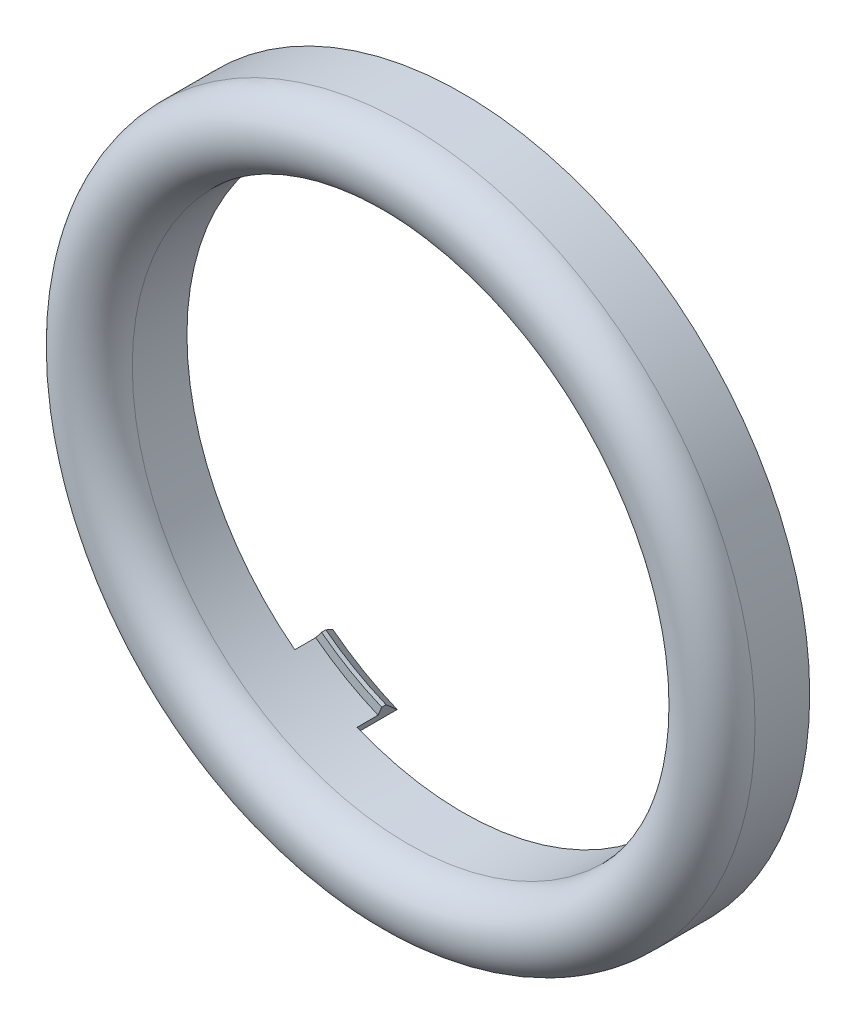
ISO-10303-21;
HEADER;
FILE_DESCRIPTION(('STEP AP214'),'2;1');
FILE_NAME('part.step','',(''),(''),'','','');
FILE_SCHEMA(('AUTOMOTIVE_DESIGN { 1 0 10303 214 1 1 1 1 }'));
ENDSEC;
DATA;
#1=APPLICATION_CONTEXT('core data for automotive mechanical design processes');
#2=APPLICATION_PROTOCOL_DEFINITION('international standard','automotive_design',2000,#1);
#3=PRODUCT_CONTEXT('',#1,'mechanical');
#4=PRODUCT('Part','Part','',(#3));
#5=PRODUCT_RELATED_PRODUCT_CATEGORY('part','',(#4));
#6=PRODUCT_DEFINITION_FORMATION('','',#4);
#7=PRODUCT_DEFINITION_CONTEXT('part definition',#1,'design');
#8=PRODUCT_DEFINITION('design','',#6,#7);
#9=PRODUCT_DEFINITION_SHAPE('','',#8);
#10=(LENGTH_UNIT() NAMED_UNIT(*) SI_UNIT(.MILLI.,.METRE.));
#11=(NAMED_UNIT(*) PLANE_ANGLE_UNIT() SI_UNIT($,.RADIAN.));
#12=(NAMED_UNIT(*) SI_UNIT($,.STERADIAN.) SOLID_ANGLE_UNIT());
#13=UNCERTAINTY_MEASURE_WITH_UNIT(LENGTH_MEASURE(1.E-05),#10,'distance_accuracy_value','');
#14=(GEOMETRIC_REPRESENTATION_CONTEXT(3) GLOBAL_UNCERTAINTY_ASSIGNED_CONTEXT((#13)) GLOBAL_UNIT_ASSIGNED_CONTEXT((#10,
#11,#12)) REPRESENTATION_CONTEXT('',''));
#15=CARTESIAN_POINT('',(0.,0.,0.));
#16=DIRECTION('',(0.,0.,1.));
#17=DIRECTION('',(1.,0.,0.));
#18=AXIS2_PLACEMENT_3D('',#15,#16,#17);
#19=CARTESIAN_POINT('',(-36.5,0.,0.));
#20=DIRECTION('',(0.,0.,-1.));
#21=DIRECTION('',(-1.,0.,0.));
#22=AXIS2_PLACEMENT_3D('',#19,#20,#21);
#23=PLANE('',#22);
#24=CARTESIAN_POINT('',(0.,0.,0.));
#25=DIRECTION('',(0.,0.,-1.));
#26=DIRECTION('',(-1.,0.,0.));
#27=AXIS2_PLACEMENT_3D('',#24,#25,#26);
#28=CIRCLE('',#27,36.5);
#29=CARTESIAN_POINT('',(-36.5,0.,0.));
#30=VERTEX_POINT('',#29);
#31=EDGE_CURVE('E11',#30,#30,#28,.T.);
#32=ORIENTED_EDGE('',*,*,#31,.T.);
#33=EDGE_LOOP('',(#32));
#34=FACE_BOUND('',#33,.T.);
#35=CARTESIAN_POINT('',(0.,0.,0.));
#36=DIRECTION('',(0.,0.,-1.));
#37=DIRECTION('',(-1.,0.,0.));
#38=AXIS2_PLACEMENT_3D('',#35,#36,#37);
#39=CIRCLE('',#38,29.);
#40=CARTESIAN_POINT('',(28.7519009798405,-3.7852595743815,0.));
#41=VERTEX_POINT('',#40);
#42=CARTESIAN_POINT('',(-11.0978195385873,-26.7925064428274,0.));
#43=VERTEX_POINT('',#42);
#44=EDGE_CURVE('E377',#41,#43,#39,.T.);
#45=ORIENTED_EDGE('',*,*,#44,.F.);
#46=DIRECTION('',(0.99144486137381,-0.130526192220052,0.));
#47=VECTOR('',#46,1.);
#48=CARTESIAN_POINT('',(29.6442013550769,-3.90273314737955,0.));
#49=LINE('',#48,#47);
#50=CARTESIAN_POINT('',(29.6442013550769,-3.90273314737955,0.));
#51=VERTEX_POINT('',#50);
#52=EDGE_CURVE('E206',#41,#51,#49,.T.);
#53=ORIENTED_EDGE('',*,*,#52,.T.);
#54=CARTESIAN_POINT('',(0.,0.,0.));
#55=DIRECTION('',(0.,0.,-1.));
#56=DIRECTION('',(-1.,0.,0.));
#57=AXIS2_PLACEMENT_3D('',#54,#55,#56);
#58=CIRCLE('',#57,29.9);
#59=CARTESIAN_POINT('',(29.6442013550769,3.90273314737955,0.));
#60=VERTEX_POINT('',#59);
#61=EDGE_CURVE('E196',#60,#51,#58,.T.);
#62=ORIENTED_EDGE('',*,*,#61,.F.);
#63=DIRECTION('',(0.99144486137381,0.130526192220052,0.));
#64=VECTOR('',#63,1.);
#65=CARTESIAN_POINT('',(29.6442013550769,3.90273314737955,0.));
#66=LINE('',#65,#64);
#67=CARTESIAN_POINT('',(28.7519009798405,3.78525957438151,0.));
#68=VERTEX_POINT('',#67);
#69=EDGE_CURVE('E234',#68,#60,#66,.T.);
#70=ORIENTED_EDGE('',*,*,#69,.F.);
#71=CARTESIAN_POINT('',(-11.0978195385877,26.7925064428273,0.));
#72=VERTEX_POINT('',#71);
#73=EDGE_CURVE('E382',#72,#68,#39,.T.);
#74=ORIENTED_EDGE('',*,*,#73,.F.);
#75=DIRECTION('',(-0.382683432365094,0.923879532511285,0.));
#76=VECTOR('',#75,1.);
#77=CARTESIAN_POINT('',(-11.4422346277163,27.6239980220874,0.));
#78=LINE('',#77,#76);
#79=CARTESIAN_POINT('',(-11.4422346277163,27.6239980220874,0.));
#80=VERTEX_POINT('',#79);
#81=EDGE_CURVE('E263',#72,#80,#78,.T.);
#82=ORIENTED_EDGE('',*,*,#81,.T.);
#83=CARTESIAN_POINT('',(0.,0.,0.));
#84=DIRECTION('',(0.,0.,-1.));
#85=DIRECTION('',(0.500000000000004,-0.866025403784436,0.));
#86=AXIS2_PLACEMENT_3D('',#83,#84,#85);
#87=CIRCLE('',#86,29.9);
#88=CARTESIAN_POINT('',(-18.2019667273609,23.7212648747078,0.));
#89=VERTEX_POINT('',#88);
#90=EDGE_CURVE('E302',#89,#80,#87,.T.);
#91=ORIENTED_EDGE('',*,*,#90,.F.);
#92=DIRECTION('',(-0.608761429008725,0.793353340291232,0.));
#93=VECTOR('',#92,1.);
#94=CARTESIAN_POINT('',(-18.2019667273609,23.7212648747078,0.));
#95=LINE('',#94,#93);
#96=CARTESIAN_POINT('',(-17.654081441253,23.0072468684457,0.));
#97=VERTEX_POINT('',#96);
#98=EDGE_CURVE('E286',#97,#89,#95,.T.);
#99=ORIENTED_EDGE('',*,*,#98,.F.);
#100=CARTESIAN_POINT('',(-17.6540814412527,-23.007246868446,0.));
#101=VERTEX_POINT('',#100);
#102=EDGE_CURVE('E378',#101,#97,#39,.T.);
#103=ORIENTED_EDGE('',*,*,#102,.F.);
#104=DIRECTION('',(-0.608761429008713,-0.793353340291241,0.));
#105=VECTOR('',#104,1.);
#106=CARTESIAN_POINT('',(-18.2019667273605,-23.7212648747081,0.));
#107=LINE('',#106,#105);
#108=CARTESIAN_POINT('',(-18.2019667273605,-23.7212648747081,0.));
#109=VERTEX_POINT('',#108);
#110=EDGE_CURVE('E322',#101,#109,#107,.T.);
#111=ORIENTED_EDGE('',*,*,#110,.T.);
#112=CARTESIAN_POINT('',(0.,0.,0.));
#113=DIRECTION('',(0.,0.,-1.));
#114=DIRECTION('',(0.499999999999992,0.866025403784443,0.));
#115=AXIS2_PLACEMENT_3D('',#112,#113,#114);
#116=CIRCLE('',#115,29.9);
#117=CARTESIAN_POINT('',(-11.4422346277159,-27.6239980220876,0.));
#118=VERTEX_POINT('',#117);
#119=EDGE_CURVE('E364',#118,#109,#116,.T.);
#120=ORIENTED_EDGE('',*,*,#119,.F.);
#121=DIRECTION('',(-0.382683432365081,-0.92387953251129,0.));
#122=VECTOR('',#121,1.);
#123=CARTESIAN_POINT('',(-11.4422346277159,-27.6239980220876,0.));
#124=LINE('',#123,#122);
#125=EDGE_CURVE('E345',#43,#118,#124,.T.);
#126=ORIENTED_EDGE('',*,*,#125,.F.);
#127=EDGE_LOOP('',(#45,#53,#62,#70,#74,#82,#91,#99,#103,#111,#120,#126));
#128=FACE_BOUND('',#127,.T.);
#129=ADVANCED_FACE('F49',(#34,#128),#23,.T.);
#130=CARTESIAN_POINT('',(0.,0.,0.));
#131=DIRECTION('',(0.,0.,-1.));
#132=DIRECTION('',(-1.,0.,0.));
#133=AXIS2_PLACEMENT_3D('',#130,#131,#132);
#134=CYLINDRICAL_SURFACE('',#133,36.5);
#135=CARTESIAN_POINT('',(0.,0.,5.75));
#136=DIRECTION('',(0.,0.,-1.));
#137=DIRECTION('',(-1.,0.,0.));
#138=AXIS2_PLACEMENT_3D('',#135,#136,#137);
#139=CIRCLE('',#138,36.5);
#140=CARTESIAN_POINT('',(-36.5,0.,5.75));
#141=VERTEX_POINT('',#140);
#142=EDGE_CURVE('E57',#141,#141,#139,.T.);
#143=ORIENTED_EDGE('',*,*,#142,.T.);
#144=EDGE_LOOP('',(#143));
#145=FACE_BOUND('',#144,.T.);
#146=ORIENTED_EDGE('',*,*,#31,.F.);
#147=EDGE_LOOP('',(#146));
#148=FACE_BOUND('',#147,.T.);
#149=ADVANCED_FACE('F389',(#145,#148),#134,.T.);
#150=CARTESIAN_POINT('',(0.,0.,5.75));
#151=DIRECTION('',(0.,0.,-1.));
#152=DIRECTION('',(-1.,0.,0.));
#153=AXIS2_PLACEMENT_3D('',#150,#151,#152);
#154=TOROIDAL_SURFACE('',#153,32.75,3.75);
#155=CARTESIAN_POINT('',(0.,0.,5.75));
#156=DIRECTION('',(0.,0.,-1.));
#157=DIRECTION('',(-1.,0.,0.));
#158=AXIS2_PLACEMENT_3D('',#155,#156,#157);
#159=CIRCLE('',#158,29.);
#160=CARTESIAN_POINT('',(-29.,0.,5.75));
#161=VERTEX_POINT('',#160);
#162=EDGE_CURVE('E381',#161,#161,#159,.T.);
#163=ORIENTED_EDGE('',*,*,#162,.T.);
#164=EDGE_LOOP('',(#163));
#165=FACE_BOUND('',#164,.T.);
#166=ORIENTED_EDGE('',*,*,#142,.F.);
#167=EDGE_LOOP('',(#166));
#168=FACE_BOUND('',#167,.T.);
#169=ADVANCED_FACE('F392',(#165,#168),#154,.T.);
#170=CARTESIAN_POINT('',(0.,0.,0.));
#171=DIRECTION('',(0.,0.,-1.));
#172=DIRECTION('',(-1.,0.,0.));
#173=AXIS2_PLACEMENT_3D('',#170,#171,#172);
#174=CYLINDRICAL_SURFACE('',#173,29.);
#175=ORIENTED_EDGE('',*,*,#102,.T.);
#176=DIRECTION('',(0.,0.,1.));
#177=VECTOR('',#176,1.);
#178=CARTESIAN_POINT('',(-17.654081441253,23.0072468684457,-2.2));
#179=LINE('',#178,#177);
#180=CARTESIAN_POINT('',(-17.654081441253,23.0072468684457,-2.2));
#181=VERTEX_POINT('',#180);
#182=EDGE_CURVE('E283',#181,#97,#179,.T.);
#183=ORIENTED_EDGE('',*,*,#182,.F.);
#184=CARTESIAN_POINT('',(0.,0.,-2.2));
#185=DIRECTION('',(0.,0.,-1.));
#186=DIRECTION('',(0.500000000000004,-0.866025403784436,0.));
#187=AXIS2_PLACEMENT_3D('',#184,#185,#186);
#188=CIRCLE('',#187,29.);
#189=CARTESIAN_POINT('',(-11.0978195385877,26.7925064428273,-2.2));
#190=VERTEX_POINT('',#189);
#191=EDGE_CURVE('E299',#181,#190,#188,.T.);
#192=ORIENTED_EDGE('',*,*,#191,.T.);
#193=DIRECTION('',(0.,0.,1.));
#194=VECTOR('',#193,1.);
#195=CARTESIAN_POINT('',(-11.0978195385877,26.7925064428273,-2.2));
#196=LINE('',#195,#194);
#197=EDGE_CURVE('E260',#190,#72,#196,.T.);
#198=ORIENTED_EDGE('',*,*,#197,.T.);
#199=ORIENTED_EDGE('',*,*,#73,.T.);
#200=DIRECTION('',(0.,0.,1.));
#201=VECTOR('',#200,1.);
#202=CARTESIAN_POINT('',(28.7519009798405,3.78525957438151,-2.2));
#203=LINE('',#202,#201);
#204=CARTESIAN_POINT('',(28.7519009798405,3.78525957438151,-2.2));
#205=VERTEX_POINT('',#204);
#206=EDGE_CURVE('E190',#205,#68,#203,.T.);
#207=ORIENTED_EDGE('',*,*,#206,.F.);
#208=CARTESIAN_POINT('',(0.,0.,-2.2));
#209=DIRECTION('',(0.,0.,-1.));
#210=DIRECTION('',(-1.,0.,0.));
#211=AXIS2_PLACEMENT_3D('',#208,#209,#210);
#212=CIRCLE('',#211,29.);
#213=CARTESIAN_POINT('',(28.7519009798405,-3.7852595743815,-2.2));
#214=VERTEX_POINT('',#213);
#215=EDGE_CURVE('E182',#205,#214,#212,.T.);
#216=ORIENTED_EDGE('',*,*,#215,.T.);
#217=DIRECTION('',(0.,0.,1.));
#218=VECTOR('',#217,1.);
#219=CARTESIAN_POINT('',(28.7519009798405,-3.7852595743815,-2.2));
#220=LINE('',#219,#218);
#221=EDGE_CURVE('E187',#214,#41,#220,.T.);
#222=ORIENTED_EDGE('',*,*,#221,.T.);
#223=ORIENTED_EDGE('',*,*,#44,.T.);
#224=DIRECTION('',(0.,0.,1.));
#225=VECTOR('',#224,1.);
#226=CARTESIAN_POINT('',(-11.0978195385873,-26.7925064428274,-2.2));
#227=LINE('',#226,#225);
#228=CARTESIAN_POINT('',(-11.0978195385873,-26.7925064428274,-2.2));
#229=VERTEX_POINT('',#228);
#230=EDGE_CURVE('E341',#229,#43,#227,.T.);
#231=ORIENTED_EDGE('',*,*,#230,.F.);
#232=CARTESIAN_POINT('',(0.,0.,-2.2));
#233=DIRECTION('',(0.,0.,-1.));
#234=DIRECTION('',(0.499999999999992,0.866025403784443,0.));
#235=AXIS2_PLACEMENT_3D('',#232,#233,#234);
#236=CIRCLE('',#235,29.);
#237=CARTESIAN_POINT('',(-17.6540814412527,-23.007246868446,-2.2));
#238=VERTEX_POINT('',#237);
#239=EDGE_CURVE('E361',#229,#238,#236,.T.);
#240=ORIENTED_EDGE('',*,*,#239,.T.);
#241=DIRECTION('',(0.,0.,1.));
#242=VECTOR('',#241,1.);
#243=CARTESIAN_POINT('',(-17.6540814412527,-23.007246868446,-2.2));
#244=LINE('',#243,#242);
#245=EDGE_CURVE('E318',#238,#101,#244,.T.);
#246=ORIENTED_EDGE('',*,*,#245,.T.);
#247=EDGE_LOOP('',(#175,#183,#192,#198,#199,#207,#216,#222,#223,#231,#240,#246));
#248=FACE_BOUND('',#247,.T.);
#249=ORIENTED_EDGE('',*,*,#162,.F.);
#250=EDGE_LOOP('',(#249));
#251=FACE_BOUND('',#250,.T.);
#252=ADVANCED_FACE('F185',(#248,#251),#174,.F.);
#253=CARTESIAN_POINT('',(-11.0978195385873,-26.7925064428274,-2.2));
#254=DIRECTION('',(0.,0.,-1.));
#255=DIRECTION('',(0.499999999999992,0.866025403784443,0.));
#256=AXIS2_PLACEMENT_3D('',#253,#254,#255);
#257=PLANE('',#256);
#258=CARTESIAN_POINT('',(0.,0.,-2.20000000000001));
#259=DIRECTION('',(0.,0.,-1.));
#260=DIRECTION('',(0.499999999999992,0.866025403784443,0.));
#261=AXIS2_PLACEMENT_3D('',#258,#259,#260);
#262=CIRCLE('',#261,28.);
#263=CARTESIAN_POINT('',(-10.7151361062223,-25.8686269103161,-2.20000000000001));
#264=VERTEX_POINT('',#263);
#265=CARTESIAN_POINT('',(-17.045320012244,-22.2138935281547,-2.20000000000001));
#266=VERTEX_POINT('',#265);
#267=EDGE_CURVE('E374',#264,#266,#262,.T.);
#268=ORIENTED_EDGE('',*,*,#267,.T.);
#269=DIRECTION('',(-0.608761429008713,-0.793353340291241,0.));
#270=VECTOR('',#269,1.);
#271=CARTESIAN_POINT('',(-17.6540814412527,-23.007246868446,-2.2));
#272=LINE('',#271,#270);
#273=EDGE_CURVE('E314',#266,#238,#272,.T.);
#274=ORIENTED_EDGE('',*,*,#273,.T.);
#275=ORIENTED_EDGE('',*,*,#239,.F.);
#276=DIRECTION('',(-0.382683432365081,-0.92387953251129,0.));
#277=VECTOR('',#276,1.);
#278=CARTESIAN_POINT('',(-11.0978195385873,-26.7925064428274,-2.2));
#279=LINE('',#278,#277);
#280=EDGE_CURVE('E337',#264,#229,#279,.T.);
#281=ORIENTED_EDGE('',*,*,#280,.F.);
#282=EDGE_LOOP('',(#268,#274,#275,#281));
#283=FACE_BOUND('',#282,.T.);
#284=ADVANCED_FACE('F400',(#283),#257,.F.);
#285=CARTESIAN_POINT('',(0.,0.,0.));
#286=DIRECTION('',(0.,0.,-1.));
#287=DIRECTION('',(0.499999999999992,0.866025403784443,0.));
#288=AXIS2_PLACEMENT_3D('',#285,#286,#287);
#289=CYLINDRICAL_SURFACE('',#288,28.);
#290=CARTESIAN_POINT('',(0.,0.,-2.64999999999997));
#291=DIRECTION('',(0.,0.,-1.));
#292=DIRECTION('',(0.499999999999992,0.866025403784443,0.));
#293=AXIS2_PLACEMENT_3D('',#290,#291,#292);
#294=CIRCLE('',#293,28.);
#295=CARTESIAN_POINT('',(-10.7151361062223,-25.8686269103161,-2.64999999999997));
#296=VERTEX_POINT('',#295);
#297=CARTESIAN_POINT('',(-17.045320012244,-22.2138935281547,-2.64999999999997));
#298=VERTEX_POINT('',#297);
#299=EDGE_CURVE('E371',#296,#298,#294,.T.);
#300=ORIENTED_EDGE('',*,*,#299,.T.);
#301=DIRECTION('',(0.,0.,1.));
#302=VECTOR('',#301,1.);
#303=CARTESIAN_POINT('',(-17.045320012244,-22.2138935281547,-2.20000000000001));
#304=LINE('',#303,#302);
#305=EDGE_CURVE('E333',#298,#266,#304,.T.);
#306=ORIENTED_EDGE('',*,*,#305,.T.);
#307=ORIENTED_EDGE('',*,*,#267,.F.);
#308=DIRECTION('',(0.,0.,1.));
#309=VECTOR('',#308,1.);
#310=CARTESIAN_POINT('',(-10.7151361062223,-25.8686269103161,-2.20000000000001));
#311=LINE('',#310,#309);
#312=EDGE_CURVE('E357',#296,#264,#311,.T.);
#313=ORIENTED_EDGE('',*,*,#312,.F.);
#314=EDGE_LOOP('',(#300,#306,#307,#313));
#315=FACE_BOUND('',#314,.T.);
#316=ADVANCED_FACE('F474',(#315),#289,.F.);
#317=CARTESIAN_POINT('',(0.,0.,-4.55));
#318=DIRECTION('',(0.,0.,-1.));
#319=DIRECTION('',(0.499999999999992,0.866025403784443,0.));
#320=AXIS2_PLACEMENT_3D('',#317,#318,#319);
#321=CONICAL_SURFACE('',#320,29.9,0.785398163397443);
#322=CARTESIAN_POINT('',(0.,0.,-4.55));
#323=DIRECTION('',(0.,0.,-1.));
#324=DIRECTION('',(0.499999999999992,0.866025403784443,0.));
#325=AXIS2_PLACEMENT_3D('',#322,#323,#324);
#326=CIRCLE('',#325,29.9);
#327=CARTESIAN_POINT('',(-11.4422346277159,-27.6239980220876,-4.55));
#328=VERTEX_POINT('',#327);
#329=CARTESIAN_POINT('',(-18.2019667273605,-23.7212648747081,-4.55));
#330=VERTEX_POINT('',#329);
#331=EDGE_CURVE('E368',#328,#330,#326,.T.);
#332=ORIENTED_EDGE('',*,*,#331,.T.);
#333=DIRECTION('',(0.430459334576871,0.560985526796931,0.707106781186553));
#334=VECTOR('',#333,1.);
#335=CARTESIAN_POINT('',(-17.045320012244,-22.2138935281547,-2.64999999999997));
#336=LINE('',#335,#334);
#337=EDGE_CURVE('E329',#330,#298,#336,.T.);
#338=ORIENTED_EDGE('',*,*,#337,.T.);
#339=ORIENTED_EDGE('',*,*,#299,.F.);
#340=DIRECTION('',(0.27059805007309,0.653281482438186,0.707106781186553));
#341=VECTOR('',#340,1.);
#342=CARTESIAN_POINT('',(-10.7151361062223,-25.8686269103161,-2.64999999999997));
#343=LINE('',#342,#341);
#344=EDGE_CURVE('E353',#328,#296,#343,.T.);
#345=ORIENTED_EDGE('',*,*,#344,.F.);
#346=EDGE_LOOP('',(#332,#338,#339,#345));
#347=FACE_BOUND('',#346,.T.);
#348=ADVANCED_FACE('F478',(#347),#321,.F.);
#349=CARTESIAN_POINT('',(0.,0.,0.));
#350=DIRECTION('',(0.,0.,-1.));
#351=DIRECTION('',(0.499999999999992,0.866025403784443,0.));
#352=AXIS2_PLACEMENT_3D('',#349,#350,#351);
#353=CYLINDRICAL_SURFACE('',#352,29.9);
#354=ORIENTED_EDGE('',*,*,#119,.T.);
#355=DIRECTION('',(0.,0.,-1.));
#356=VECTOR('',#355,1.);
#357=CARTESIAN_POINT('',(-18.2019667273605,-23.7212648747081,-4.55));
#358=LINE('',#357,#356);
#359=EDGE_CURVE('E325',#109,#330,#358,.T.);
#360=ORIENTED_EDGE('',*,*,#359,.T.);
#361=ORIENTED_EDGE('',*,*,#331,.F.);
#362=DIRECTION('',(0.,0.,-1.));
#363=VECTOR('',#362,1.);
#364=CARTESIAN_POINT('',(-11.4422346277159,-27.6239980220876,-4.55));
#365=LINE('',#364,#363);
#366=EDGE_CURVE('E349',#118,#328,#365,.T.);
#367=ORIENTED_EDGE('',*,*,#366,.F.);
#368=EDGE_LOOP('',(#354,#360,#361,#367));
#369=FACE_BOUND('',#368,.T.);
#370=ADVANCED_FACE('F470',(#369),#353,.T.);
#371=CARTESIAN_POINT('',(0.,0.,0.));
#372=DIRECTION('',(-0.92387953251129,0.382683432365081,0.));
#373=DIRECTION('',(0.,0.,-1.));
#374=AXIS2_PLACEMENT_3D('',#371,#372,#373);
#375=PLANE('',#374);
#376=ORIENTED_EDGE('',*,*,#280,.T.);
#377=ORIENTED_EDGE('',*,*,#230,.T.);
#378=ORIENTED_EDGE('',*,*,#125,.T.);
#379=ORIENTED_EDGE('',*,*,#366,.T.);
#380=ORIENTED_EDGE('',*,*,#344,.T.);
#381=ORIENTED_EDGE('',*,*,#312,.T.);
#382=EDGE_LOOP('',(#376,#377,#378,#379,#380,#381));
#383=FACE_BOUND('',#382,.T.);
#384=ADVANCED_FACE('F466',(#383),#375,.F.);
#385=CARTESIAN_POINT('',(0.,0.,0.));
#386=DIRECTION('',(-0.793353340291241,0.608761429008713,0.));
#387=DIRECTION('',(0.,0.,-1.));
#388=AXIS2_PLACEMENT_3D('',#385,#386,#387);
#389=PLANE('',#388);
#390=ORIENTED_EDGE('',*,*,#273,.F.);
#391=ORIENTED_EDGE('',*,*,#305,.F.);
#392=ORIENTED_EDGE('',*,*,#337,.F.);
#393=ORIENTED_EDGE('',*,*,#359,.F.);
#394=ORIENTED_EDGE('',*,*,#110,.F.);
#395=ORIENTED_EDGE('',*,*,#245,.F.);
#396=EDGE_LOOP('',(#390,#391,#392,#393,#394,#395));
#397=FACE_BOUND('',#396,.T.);
#398=ADVANCED_FACE('F453',(#397),#389,.T.);
#399=CARTESIAN_POINT('',(-17.654081441253,23.0072468684457,-2.2));
#400=DIRECTION('',(0.,0.,-1.));
#401=DIRECTION('',(0.500000000000004,-0.866025403784436,0.));
#402=AXIS2_PLACEMENT_3D('',#399,#400,#401);
#403=PLANE('',#402);
#404=CARTESIAN_POINT('',(0.,0.,-2.20000000000001));
#405=DIRECTION('',(0.,0.,-1.));
#406=DIRECTION('',(0.500000000000004,-0.866025403784436,0.));
#407=AXIS2_PLACEMENT_3D('',#404,#405,#406);
#408=CIRCLE('',#407,28.);
#409=CARTESIAN_POINT('',(-17.0453200122443,22.2138935281545,-2.20000000000001));
#410=VERTEX_POINT('',#409);
#411=CARTESIAN_POINT('',(-10.7151361062226,25.868626910316,-2.20000000000001));
#412=VERTEX_POINT('',#411);
#413=EDGE_CURVE('E311',#410,#412,#408,.T.);
#414=ORIENTED_EDGE('',*,*,#413,.T.);
#415=DIRECTION('',(-0.382683432365094,0.923879532511285,0.));
#416=VECTOR('',#415,1.);
#417=CARTESIAN_POINT('',(-11.0978195385877,26.7925064428273,-2.2));
#418=LINE('',#417,#416);
#419=EDGE_CURVE('E256',#412,#190,#418,.T.);
#420=ORIENTED_EDGE('',*,*,#419,.T.);
#421=ORIENTED_EDGE('',*,*,#191,.F.);
#422=DIRECTION('',(-0.608761429008725,0.793353340291232,0.));
#423=VECTOR('',#422,1.);
#424=CARTESIAN_POINT('',(-17.654081441253,23.0072468684457,-2.2));
#425=LINE('',#424,#423);
#426=EDGE_CURVE('E279',#410,#181,#425,.T.);
#427=ORIENTED_EDGE('',*,*,#426,.F.);
#428=EDGE_LOOP('',(#414,#420,#421,#427));
#429=FACE_BOUND('',#428,.T.);
#430=ADVANCED_FACE('F449',(#429),#403,.F.);
#431=CARTESIAN_POINT('',(0.,0.,0.));
#432=DIRECTION('',(0.,0.,-1.));
#433=DIRECTION('',(0.500000000000004,-0.866025403784436,0.));
#434=AXIS2_PLACEMENT_3D('',#431,#432,#433);
#435=CYLINDRICAL_SURFACE('',#434,28.);
#436=CARTESIAN_POINT('',(0.,0.,-2.64999999999997));
#437=DIRECTION('',(0.,0.,-1.));
#438=DIRECTION('',(0.500000000000004,-0.866025403784436,0.));
#439=AXIS2_PLACEMENT_3D('',#436,#437,#438);
#440=CIRCLE('',#439,28.);
#441=CARTESIAN_POINT('',(-17.0453200122443,22.2138935281545,-2.64999999999997));
#442=VERTEX_POINT('',#441);
#443=CARTESIAN_POINT('',(-10.7151361062226,25.868626910316,-2.64999999999997));
#444=VERTEX_POINT('',#443);
#445=EDGE_CURVE('E308',#442,#444,#440,.T.);
#446=ORIENTED_EDGE('',*,*,#445,.T.);
#447=DIRECTION('',(0.,0.,1.));
#448=VECTOR('',#447,1.);
#449=CARTESIAN_POINT('',(-10.7151361062226,25.868626910316,-2.20000000000001));
#450=LINE('',#449,#448);
#451=EDGE_CURVE('E275',#444,#412,#450,.T.);
#452=ORIENTED_EDGE('',*,*,#451,.T.);
#453=ORIENTED_EDGE('',*,*,#413,.F.);
#454=DIRECTION('',(0.,0.,1.));
#455=VECTOR('',#454,1.);
#456=CARTESIAN_POINT('',(-17.0453200122443,22.2138935281545,-2.20000000000001));
#457=LINE('',#456,#455);
#458=EDGE_CURVE('E295',#442,#410,#457,.T.);
#459=ORIENTED_EDGE('',*,*,#458,.F.);
#460=EDGE_LOOP('',(#446,#452,#453,#459));
#461=FACE_BOUND('',#460,.T.);
#462=ADVANCED_FACE('F452',(#461),#435,.F.);
#463=CARTESIAN_POINT('',(0.,0.,-4.55));
#464=DIRECTION('',(0.,0.,-1.));
#465=DIRECTION('',(0.500000000000004,-0.866025403784436,0.));
#466=AXIS2_PLACEMENT_3D('',#463,#464,#465);
#467=CONICAL_SURFACE('',#466,29.9,0.785398163397443);
#468=CARTESIAN_POINT('',(0.,0.,-4.55));
#469=DIRECTION('',(0.,0.,-1.));
#470=DIRECTION('',(0.500000000000004,-0.866025403784436,0.));
#471=AXIS2_PLACEMENT_3D('',#468,#469,#470);
#472=CIRCLE('',#471,29.9);
#473=CARTESIAN_POINT('',(-18.2019667273609,23.7212648747078,-4.55));
#474=VERTEX_POINT('',#473);
#475=CARTESIAN_POINT('',(-11.4422346277163,27.6239980220874,-4.55));
#476=VERTEX_POINT('',#475);
#477=EDGE_CURVE('E305',#474,#476,#472,.T.);
#478=ORIENTED_EDGE('',*,*,#477,.T.);
#479=DIRECTION('',(0.270598050073099,-0.653281482438183,0.707106781186553));
#480=VECTOR('',#479,1.);
#481=CARTESIAN_POINT('',(-10.7151361062226,25.868626910316,-2.64999999999997));
#482=LINE('',#481,#480);
#483=EDGE_CURVE('E271',#476,#444,#482,.T.);
#484=ORIENTED_EDGE('',*,*,#483,.T.);
#485=ORIENTED_EDGE('',*,*,#445,.F.);
#486=DIRECTION('',(0.430459334576879,-0.560985526796925,0.707106781186553));
#487=VECTOR('',#486,1.);
#488=CARTESIAN_POINT('',(-17.0453200122443,22.2138935281545,-2.64999999999997));
#489=LINE('',#488,#487);
#490=EDGE_CURVE('E291',#474,#442,#489,.T.);
#491=ORIENTED_EDGE('',*,*,#490,.F.);
#492=EDGE_LOOP('',(#478,#484,#485,#491));
#493=FACE_BOUND('',#492,.T.);
#494=ADVANCED_FACE('F457',(#493),#467,.F.);
#495=CARTESIAN_POINT('',(0.,0.,0.));
#496=DIRECTION('',(0.,0.,-1.));
#497=DIRECTION('',(0.500000000000004,-0.866025403784436,0.));
#498=AXIS2_PLACEMENT_3D('',#495,#496,#497);
#499=CYLINDRICAL_SURFACE('',#498,29.9);
#500=ORIENTED_EDGE('',*,*,#90,.T.);
#501=DIRECTION('',(0.,0.,-1.));
#502=VECTOR('',#501,1.);
#503=CARTESIAN_POINT('',(-11.4422346277163,27.6239980220874,-4.55));
#504=LINE('',#503,#502);
#505=EDGE_CURVE('E267',#80,#476,#504,.T.);
#506=ORIENTED_EDGE('',*,*,#505,.T.);
#507=ORIENTED_EDGE('',*,*,#477,.F.);
#508=DIRECTION('',(0.,0.,-1.));
#509=VECTOR('',#508,1.);
#510=CARTESIAN_POINT('',(-18.2019667273609,23.7212648747078,-4.55));
#511=LINE('',#510,#509);
#512=EDGE_CURVE('E75',#89,#474,#511,.T.);
#513=ORIENTED_EDGE('',*,*,#512,.F.);
#514=EDGE_LOOP('',(#500,#506,#507,#513));
#515=FACE_BOUND('',#514,.T.);
#516=ADVANCED_FACE('F447',(#515),#499,.T.);
#517=CARTESIAN_POINT('',(0.,0.,0.));
#518=DIRECTION('',(0.793353340291232,0.608761429008725,0.));
#519=DIRECTION('',(0.,0.,-1.));
#520=AXIS2_PLACEMENT_3D('',#517,#518,#519);
#521=PLANE('',#520);
#522=ORIENTED_EDGE('',*,*,#426,.T.);
#523=ORIENTED_EDGE('',*,*,#182,.T.);
#524=ORIENTED_EDGE('',*,*,#98,.T.);
#525=ORIENTED_EDGE('',*,*,#512,.T.);
#526=ORIENTED_EDGE('',*,*,#490,.T.);
#527=ORIENTED_EDGE('',*,*,#458,.T.);
#528=EDGE_LOOP('',(#522,#523,#524,#525,#526,#527));
#529=FACE_BOUND('',#528,.T.);
#530=ADVANCED_FACE('F443',(#529),#521,.F.);
#531=CARTESIAN_POINT('',(0.,0.,0.));
#532=DIRECTION('',(0.923879532511285,0.382683432365094,0.));
#533=DIRECTION('',(0.,0.,-1.));
#534=AXIS2_PLACEMENT_3D('',#531,#532,#533);
#535=PLANE('',#534);
#536=ORIENTED_EDGE('',*,*,#419,.F.);
#537=ORIENTED_EDGE('',*,*,#451,.F.);
#538=ORIENTED_EDGE('',*,*,#483,.F.);
#539=ORIENTED_EDGE('',*,*,#505,.F.);
#540=ORIENTED_EDGE('',*,*,#81,.F.);
#541=ORIENTED_EDGE('',*,*,#197,.F.);
#542=EDGE_LOOP('',(#536,#537,#538,#539,#540,#541));
#543=FACE_BOUND('',#542,.T.);
#544=ADVANCED_FACE('F440',(#543),#535,.T.);
#545=CARTESIAN_POINT('',(28.7519009798405,3.78525957438151,-2.2));
#546=DIRECTION('',(0.,0.,-1.));
#547=DIRECTION('',(-1.,0.,0.));
#548=AXIS2_PLACEMENT_3D('',#545,#546,#547);
#549=PLANE('',#548);
#550=CARTESIAN_POINT('',(0.,0.,-2.20000000000001));
#551=DIRECTION('',(0.,0.,-1.));
#552=DIRECTION('',(-1.,0.,0.));
#553=AXIS2_PLACEMENT_3D('',#550,#551,#552);
#554=CIRCLE('',#553,28.);
#555=CARTESIAN_POINT('',(27.7604561184667,3.65473338216145,-2.20000000000001));
#556=VERTEX_POINT('',#555);
#557=CARTESIAN_POINT('',(27.7604561184667,-3.65473338216145,-2.20000000000001));
#558=VERTEX_POINT('',#557);
#559=EDGE_CURVE('E211',#556,#558,#554,.T.);
#560=ORIENTED_EDGE('',*,*,#559,.T.);
#561=DIRECTION('',(0.99144486137381,-0.130526192220052,0.));
#562=VECTOR('',#561,1.);
#563=CARTESIAN_POINT('',(28.7519009798405,-3.7852595743815,-2.2));
#564=LINE('',#563,#562);
#565=EDGE_CURVE('E203',#558,#214,#564,.T.);
#566=ORIENTED_EDGE('',*,*,#565,.T.);
#567=ORIENTED_EDGE('',*,*,#215,.F.);
#568=DIRECTION('',(0.99144486137381,0.130526192220052,0.));
#569=VECTOR('',#568,1.);
#570=CARTESIAN_POINT('',(28.7519009798405,3.78525957438151,-2.2));
#571=LINE('',#570,#569);
#572=EDGE_CURVE('E229',#556,#205,#571,.T.);
#573=ORIENTED_EDGE('',*,*,#572,.F.);
#574=EDGE_LOOP('',(#560,#566,#567,#573));
#575=FACE_BOUND('',#574,.T.);
#576=ADVANCED_FACE('F210',(#575),#549,.F.);
#577=CARTESIAN_POINT('',(0.,0.,0.));
#578=DIRECTION('',(0.,0.,-1.));
#579=DIRECTION('',(-1.,0.,0.));
#580=AXIS2_PLACEMENT_3D('',#577,#578,#579);
#581=CYLINDRICAL_SURFACE('',#580,28.);
#582=CARTESIAN_POINT('',(0.,0.,-2.64999999999997));
#583=DIRECTION('',(0.,0.,-1.));
#584=DIRECTION('',(-1.,0.,0.));
#585=AXIS2_PLACEMENT_3D('',#582,#583,#584);
#586=CIRCLE('',#585,28.);
#587=CARTESIAN_POINT('',(27.7604561184667,3.65473338216145,-2.64999999999997));
#588=VERTEX_POINT('',#587);
#589=CARTESIAN_POINT('',(27.7604561184667,-3.65473338216145,-2.64999999999997));
#590=VERTEX_POINT('',#589);
#591=EDGE_CURVE('E251',#588,#590,#586,.T.);
#592=ORIENTED_EDGE('',*,*,#591,.T.);
#593=DIRECTION('',(0.,0.,1.));
#594=VECTOR('',#593,1.);
#595=CARTESIAN_POINT('',(27.7604561184667,-3.65473338216145,-2.20000000000001));
#596=LINE('',#595,#594);
#597=EDGE_CURVE('E226',#590,#558,#596,.T.);
#598=ORIENTED_EDGE('',*,*,#597,.T.);
#599=ORIENTED_EDGE('',*,*,#559,.F.);
#600=DIRECTION('',(0.,0.,1.));
#601=VECTOR('',#600,1.);
#602=CARTESIAN_POINT('',(27.7604561184667,3.65473338216145,-2.20000000000001));
#603=LINE('',#602,#601);
#604=EDGE_CURVE('E197',#588,#556,#603,.T.);
#605=ORIENTED_EDGE('',*,*,#604,.F.);
#606=EDGE_LOOP('',(#592,#598,#599,#605));
#607=FACE_BOUND('',#606,.T.);
#608=ADVANCED_FACE('F423',(#607),#581,.F.);
#609=CARTESIAN_POINT('',(0.,0.,-4.55));
#610=DIRECTION('',(0.,0.,-1.));
#611=DIRECTION('',(-1.,0.,0.));
#612=AXIS2_PLACEMENT_3D('',#609,#610,#611);
#613=CONICAL_SURFACE('',#612,29.9,0.785398163397443);
#614=CARTESIAN_POINT('',(0.,0.,-4.55));
#615=DIRECTION('',(0.,0.,-1.));
#616=DIRECTION('',(-1.,0.,0.));
#617=AXIS2_PLACEMENT_3D('',#614,#615,#616);
#618=CIRCLE('',#617,29.9);
#619=CARTESIAN_POINT('',(29.6442013550769,3.90273314737955,-4.55));
#620=VERTEX_POINT('',#619);
#621=CARTESIAN_POINT('',(29.6442013550769,-3.90273314737955,-4.55));
#622=VERTEX_POINT('',#621);
#623=EDGE_CURVE('E248',#620,#622,#618,.T.);
#624=ORIENTED_EDGE('',*,*,#623,.T.);
#625=DIRECTION('',(-0.701057384649973,0.0922959556412568,0.707106781186553));
#626=VECTOR('',#625,1.);
#627=CARTESIAN_POINT('',(27.7604561184667,-3.65473338216145,-2.64999999999997));
#628=LINE('',#627,#626);
#629=EDGE_CURVE('E222',#622,#590,#628,.T.);
#630=ORIENTED_EDGE('',*,*,#629,.T.);
#631=ORIENTED_EDGE('',*,*,#591,.F.);
#632=DIRECTION('',(-0.701057384649973,-0.0922959556412568,0.707106781186553));
#633=VECTOR('',#632,1.);
#634=CARTESIAN_POINT('',(27.7604561184667,3.65473338216145,-2.64999999999997));
#635=LINE('',#634,#633);
#636=EDGE_CURVE('E239',#620,#588,#635,.T.);
#637=ORIENTED_EDGE('',*,*,#636,.F.);
#638=EDGE_LOOP('',(#624,#630,#631,#637));
#639=FACE_BOUND('',#638,.T.);
#640=ADVANCED_FACE('F426',(#639),#613,.F.);
#641=CARTESIAN_POINT('',(0.,0.,0.));
#642=DIRECTION('',(0.,0.,-1.));
#643=DIRECTION('',(-1.,0.,0.));
#644=AXIS2_PLACEMENT_3D('',#641,#642,#643);
#645=CYLINDRICAL_SURFACE('',#644,29.9);
#646=ORIENTED_EDGE('',*,*,#61,.T.);
#647=DIRECTION('',(0.,0.,-1.));
#648=VECTOR('',#647,1.);
#649=CARTESIAN_POINT('',(29.6442013550769,-3.90273314737955,-4.55));
#650=LINE('',#649,#648);
#651=EDGE_CURVE('E218',#51,#622,#650,.T.);
#652=ORIENTED_EDGE('',*,*,#651,.T.);
#653=ORIENTED_EDGE('',*,*,#623,.F.);
#654=DIRECTION('',(0.,0.,-1.));
#655=VECTOR('',#654,1.);
#656=CARTESIAN_POINT('',(29.6442013550769,3.90273314737955,-4.55));
#657=LINE('',#656,#655);
#658=EDGE_CURVE('E67',#60,#620,#657,.T.);
#659=ORIENTED_EDGE('',*,*,#658,.F.);
#660=EDGE_LOOP('',(#646,#652,#653,#659));
#661=FACE_BOUND('',#660,.T.);
#662=ADVANCED_FACE('F427',(#661),#645,.T.);
#663=CARTESIAN_POINT('',(0.,0.,0.));
#664=DIRECTION('',(0.130526192220052,-0.99144486137381,0.));
#665=DIRECTION('',(0.,0.,-1.));
#666=AXIS2_PLACEMENT_3D('',#663,#664,#665);
#667=PLANE('',#666);
#668=ORIENTED_EDGE('',*,*,#572,.T.);
#669=ORIENTED_EDGE('',*,*,#206,.T.);
#670=ORIENTED_EDGE('',*,*,#69,.T.);
#671=ORIENTED_EDGE('',*,*,#658,.T.);
#672=ORIENTED_EDGE('',*,*,#636,.T.);
#673=ORIENTED_EDGE('',*,*,#604,.T.);
#674=EDGE_LOOP('',(#668,#669,#670,#671,#672,#673));
#675=FACE_BOUND('',#674,.T.);
#676=ADVANCED_FACE('F419',(#675),#667,.F.);
#677=CARTESIAN_POINT('',(0.,0.,0.));
#678=DIRECTION('',(-0.130526192220052,-0.99144486137381,0.));
#679=DIRECTION('',(0.,0.,-1.));
#680=AXIS2_PLACEMENT_3D('',#677,#678,#679);
#681=PLANE('',#680);
#682=ORIENTED_EDGE('',*,*,#565,.F.);
#683=ORIENTED_EDGE('',*,*,#597,.F.);
#684=ORIENTED_EDGE('',*,*,#629,.F.);
#685=ORIENTED_EDGE('',*,*,#651,.F.);
#686=ORIENTED_EDGE('',*,*,#52,.F.);
#687=ORIENTED_EDGE('',*,*,#221,.F.);
#688=EDGE_LOOP('',(#682,#683,#684,#685,#686,#687));
#689=FACE_BOUND('',#688,.T.);
#690=ADVANCED_FACE('F201',(#689),#681,.T.);
#691=CLOSED_SHELL('',(#129,#149,#169,#252,#284,#316,#348,#370,#384,#398,#430,#462,#494,#516,
#530,#544,#576,#608,#640,#662,#676,#690));
#692=MANIFOLD_SOLID_BREP('B2',#691);
#693=ADVANCED_BREP_SHAPE_REPRESENTATION('',(#18,#692),#14);
#694=SHAPE_DEFINITION_REPRESENTATION(#9,#693);
ENDSEC;
END-ISO-10303-21;
